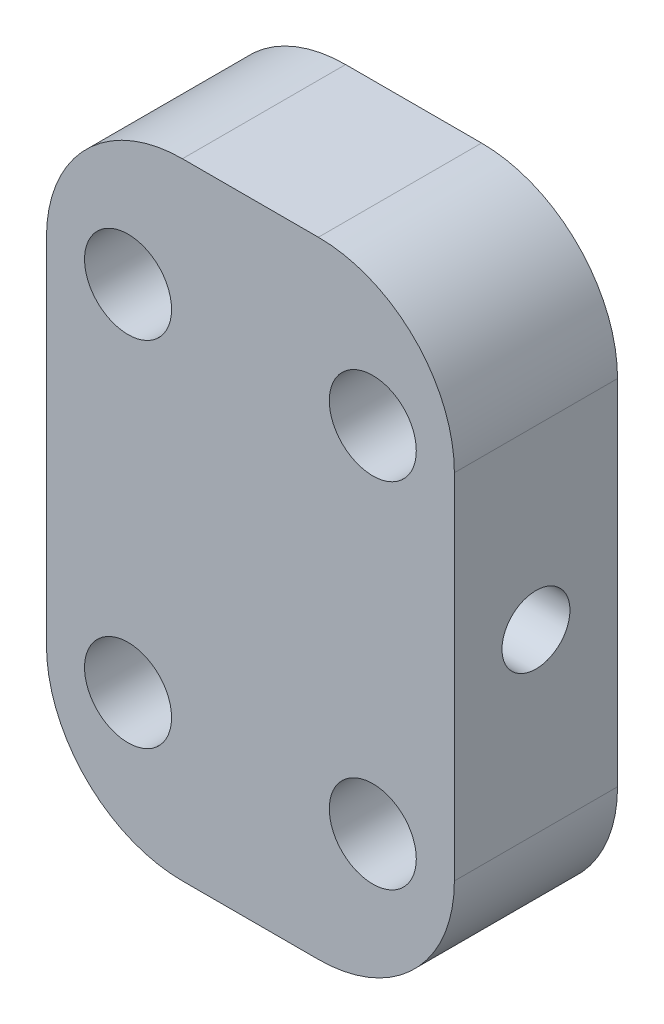
ISO-10303-21;
HEADER;
FILE_DESCRIPTION(('STEP AP214'),'2;1');
FILE_NAME('part.step','',(''),(''),'','','');
FILE_SCHEMA(('AUTOMOTIVE_DESIGN { 1 0 10303 214 1 1 1 1 }'));
ENDSEC;
DATA;
#1=APPLICATION_CONTEXT('core data for automotive mechanical design processes');
#2=APPLICATION_PROTOCOL_DEFINITION('international standard','automotive_design',2000,#1);
#3=PRODUCT_CONTEXT('',#1,'mechanical');
#4=PRODUCT('Part','Part','',(#3));
#5=PRODUCT_RELATED_PRODUCT_CATEGORY('part','',(#4));
#6=PRODUCT_DEFINITION_FORMATION('','',#4);
#7=PRODUCT_DEFINITION_CONTEXT('part definition',#1,'design');
#8=PRODUCT_DEFINITION('design','',#6,#7);
#9=PRODUCT_DEFINITION_SHAPE('','',#8);
#10=(LENGTH_UNIT() NAMED_UNIT(*) SI_UNIT(.MILLI.,.METRE.));
#11=(NAMED_UNIT(*) PLANE_ANGLE_UNIT() SI_UNIT($,.RADIAN.));
#12=(NAMED_UNIT(*) SI_UNIT($,.STERADIAN.) SOLID_ANGLE_UNIT());
#13=UNCERTAINTY_MEASURE_WITH_UNIT(LENGTH_MEASURE(1.E-05),#10,'distance_accuracy_value','');
#14=(GEOMETRIC_REPRESENTATION_CONTEXT(3) GLOBAL_UNCERTAINTY_ASSIGNED_CONTEXT((#13)) GLOBAL_UNIT_ASSIGNED_CONTEXT((#10,
#11,#12)) REPRESENTATION_CONTEXT('',''));
#15=CARTESIAN_POINT('',(0.,0.,0.));
#16=DIRECTION('',(0.,0.,1.));
#17=DIRECTION('',(1.,0.,0.));
#18=AXIS2_PLACEMENT_3D('',#15,#16,#17);
#19=CARTESIAN_POINT('',(7.5,11.5,3.));
#20=DIRECTION('',(-1.,0.,0.));
#21=DIRECTION('',(0.,-1.,0.));
#22=AXIS2_PLACEMENT_3D('',#19,#20,#21);
#23=PLANE('',#22);
#24=CARTESIAN_POINT('',(7.5,0.,0.));
#25=DIRECTION('',(1.,0.,0.));
#26=DIRECTION('',(0.,0.,-1.));
#27=AXIS2_PLACEMENT_3D('',#24,#25,#26);
#28=CIRCLE('',#27,1.25);
#29=CARTESIAN_POINT('',(7.5,0.,-1.25));
#30=VERTEX_POINT('',#29);
#31=EDGE_CURVE('E201',#30,#30,#28,.T.);
#32=ORIENTED_EDGE('',*,*,#31,.F.);
#33=EDGE_LOOP('',(#32));
#34=FACE_BOUND('',#33,.T.);
#35=DIRECTION('',(0.,1.,0.));
#36=VECTOR('',#35,1.);
#37=CARTESIAN_POINT('',(7.5,11.5,-3.));
#38=LINE('',#37,#36);
#39=CARTESIAN_POINT('',(7.5,-6.5,-3.));
#40=VERTEX_POINT('',#39);
#41=CARTESIAN_POINT('',(7.5,6.5,-3.));
#42=VERTEX_POINT('',#41);
#43=EDGE_CURVE('E125',#40,#42,#38,.T.);
#44=ORIENTED_EDGE('',*,*,#43,.T.);
#45=DIRECTION('',(0.,0.,-1.));
#46=VECTOR('',#45,1.);
#47=CARTESIAN_POINT('',(7.5,6.5,3.));
#48=LINE('',#47,#46);
#49=CARTESIAN_POINT('',(7.5,6.5,3.));
#50=VERTEX_POINT('',#49);
#51=EDGE_CURVE('E103',#42,#50,#48,.F.);
#52=ORIENTED_EDGE('',*,*,#51,.T.);
#53=DIRECTION('',(0.,1.,0.));
#54=VECTOR('',#53,1.);
#55=CARTESIAN_POINT('',(7.5,11.5,3.));
#56=LINE('',#55,#54);
#57=CARTESIAN_POINT('',(7.5,-6.5,3.));
#58=VERTEX_POINT('',#57);
#59=EDGE_CURVE('E135',#58,#50,#56,.T.);
#60=ORIENTED_EDGE('',*,*,#59,.F.);
#61=DIRECTION('',(0.,0.,-1.));
#62=VECTOR('',#61,1.);
#63=CARTESIAN_POINT('',(7.5,-6.5,3.));
#64=LINE('',#63,#62);
#65=EDGE_CURVE('E108',#58,#40,#64,.T.);
#66=ORIENTED_EDGE('',*,*,#65,.T.);
#67=EDGE_LOOP('',(#44,#52,#60,#66));
#68=FACE_BOUND('',#67,.T.);
#69=ADVANCED_FACE('F32',(#34,#68),#23,.F.);
#70=CARTESIAN_POINT('',(-7.5,11.5,3.));
#71=DIRECTION('',(0.,-1.,0.));
#72=DIRECTION('',(0.,0.,-1.));
#73=AXIS2_PLACEMENT_3D('',#70,#71,#72);
#74=PLANE('',#73);
#75=DIRECTION('',(-1.,0.,0.));
#76=VECTOR('',#75,1.);
#77=CARTESIAN_POINT('',(-7.5,11.5,3.));
#78=LINE('',#77,#76);
#79=CARTESIAN_POINT('',(2.5,11.5,3.));
#80=VERTEX_POINT('',#79);
#81=CARTESIAN_POINT('',(-2.5,11.5,3.));
#82=VERTEX_POINT('',#81);
#83=EDGE_CURVE('E118',#80,#82,#78,.T.);
#84=ORIENTED_EDGE('',*,*,#83,.F.);
#85=DIRECTION('',(0.,0.,-1.));
#86=VECTOR('',#85,1.);
#87=CARTESIAN_POINT('',(2.5,11.5,3.));
#88=LINE('',#87,#86);
#89=CARTESIAN_POINT('',(2.5,11.5,-3.));
#90=VERTEX_POINT('',#89);
#91=EDGE_CURVE('E102',#80,#90,#88,.T.);
#92=ORIENTED_EDGE('',*,*,#91,.T.);
#93=DIRECTION('',(-1.,0.,0.));
#94=VECTOR('',#93,1.);
#95=CARTESIAN_POINT('',(-7.5,11.5,-3.));
#96=LINE('',#95,#94);
#97=CARTESIAN_POINT('',(-2.5,11.5,-3.));
#98=VERTEX_POINT('',#97);
#99=EDGE_CURVE('E115',#90,#98,#96,.T.);
#100=ORIENTED_EDGE('',*,*,#99,.T.);
#101=DIRECTION('',(0.,0.,-1.));
#102=VECTOR('',#101,1.);
#103=CARTESIAN_POINT('',(-2.5,11.5,3.));
#104=LINE('',#103,#102);
#105=EDGE_CURVE('E120',#98,#82,#104,.F.);
#106=ORIENTED_EDGE('',*,*,#105,.T.);
#107=EDGE_LOOP('',(#84,#92,#100,#106));
#108=FACE_BOUND('',#107,.T.);
#109=ADVANCED_FACE('F114',(#108),#74,.F.);
#110=CARTESIAN_POINT('',(-7.5,11.5,3.));
#111=DIRECTION('',(1.,0.,0.));
#112=DIRECTION('',(0.,1.,0.));
#113=AXIS2_PLACEMENT_3D('',#110,#111,#112);
#114=PLANE('',#113);
#115=CARTESIAN_POINT('',(-7.5,0.,0.));
#116=DIRECTION('',(1.,0.,0.));
#117=DIRECTION('',(0.,0.,-1.));
#118=AXIS2_PLACEMENT_3D('',#115,#116,#117);
#119=CIRCLE('',#118,1.25);
#120=CARTESIAN_POINT('',(-7.5,0.,-1.25));
#121=VERTEX_POINT('',#120);
#122=EDGE_CURVE('E198',#121,#121,#119,.T.);
#123=ORIENTED_EDGE('',*,*,#122,.T.);
#124=EDGE_LOOP('',(#123));
#125=FACE_BOUND('',#124,.T.);
#126=DIRECTION('',(0.,-1.,0.));
#127=VECTOR('',#126,1.);
#128=CARTESIAN_POINT('',(-7.5,11.5,-3.));
#129=LINE('',#128,#127);
#130=CARTESIAN_POINT('',(-7.5,6.5,-3.));
#131=VERTEX_POINT('',#130);
#132=CARTESIAN_POINT('',(-7.5,-6.5,-3.));
#133=VERTEX_POINT('',#132);
#134=EDGE_CURVE('E124',#131,#133,#129,.T.);
#135=ORIENTED_EDGE('',*,*,#134,.T.);
#136=DIRECTION('',(0.,0.,-1.));
#137=VECTOR('',#136,1.);
#138=CARTESIAN_POINT('',(-7.5,-6.5,3.));
#139=LINE('',#138,#137);
#140=CARTESIAN_POINT('',(-7.5,-6.5,3.));
#141=VERTEX_POINT('',#140);
#142=EDGE_CURVE('E11',#133,#141,#139,.F.);
#143=ORIENTED_EDGE('',*,*,#142,.T.);
#144=DIRECTION('',(0.,-1.,0.));
#145=VECTOR('',#144,1.);
#146=CARTESIAN_POINT('',(-7.5,11.5,3.));
#147=LINE('',#146,#145);
#148=CARTESIAN_POINT('',(-7.5,6.5,3.));
#149=VERTEX_POINT('',#148);
#150=EDGE_CURVE('E161',#149,#141,#147,.T.);
#151=ORIENTED_EDGE('',*,*,#150,.F.);
#152=DIRECTION('',(0.,0.,-1.));
#153=VECTOR('',#152,1.);
#154=CARTESIAN_POINT('',(-7.5,6.5,3.));
#155=LINE('',#154,#153);
#156=EDGE_CURVE('E40',#149,#131,#155,.T.);
#157=ORIENTED_EDGE('',*,*,#156,.T.);
#158=EDGE_LOOP('',(#135,#143,#151,#157));
#159=FACE_BOUND('',#158,.T.);
#160=ADVANCED_FACE('F159',(#125,#159),#114,.F.);
#161=CARTESIAN_POINT('',(-7.5,-11.5,3.));
#162=DIRECTION('',(0.,1.,0.));
#163=DIRECTION('',(0.,0.,1.));
#164=AXIS2_PLACEMENT_3D('',#161,#162,#163);
#165=PLANE('',#164);
#166=DIRECTION('',(1.,0.,0.));
#167=VECTOR('',#166,1.);
#168=CARTESIAN_POINT('',(-7.5,-11.5,-3.));
#169=LINE('',#168,#167);
#170=CARTESIAN_POINT('',(-2.5,-11.5,-3.));
#171=VERTEX_POINT('',#170);
#172=CARTESIAN_POINT('',(2.5,-11.5,-3.));
#173=VERTEX_POINT('',#172);
#174=EDGE_CURVE('E128',#171,#173,#169,.T.);
#175=ORIENTED_EDGE('',*,*,#174,.T.);
#176=DIRECTION('',(0.,0.,-1.));
#177=VECTOR('',#176,1.);
#178=CARTESIAN_POINT('',(2.5,-11.5,3.));
#179=LINE('',#178,#177);
#180=CARTESIAN_POINT('',(2.5,-11.5,3.));
#181=VERTEX_POINT('',#180);
#182=EDGE_CURVE('E47',#173,#181,#179,.F.);
#183=ORIENTED_EDGE('',*,*,#182,.T.);
#184=DIRECTION('',(1.,0.,0.));
#185=VECTOR('',#184,1.);
#186=CARTESIAN_POINT('',(-7.5,-11.5,3.));
#187=LINE('',#186,#185);
#188=CARTESIAN_POINT('',(-2.5,-11.5,3.));
#189=VERTEX_POINT('',#188);
#190=EDGE_CURVE('E136',#189,#181,#187,.T.);
#191=ORIENTED_EDGE('',*,*,#190,.F.);
#192=DIRECTION('',(0.,0.,-1.));
#193=VECTOR('',#192,1.);
#194=CARTESIAN_POINT('',(-2.5,-11.5,3.));
#195=LINE('',#194,#193);
#196=EDGE_CURVE('E152',#189,#171,#195,.T.);
#197=ORIENTED_EDGE('',*,*,#196,.T.);
#198=EDGE_LOOP('',(#175,#183,#191,#197));
#199=FACE_BOUND('',#198,.T.);
#200=ADVANCED_FACE('F168',(#199),#165,.F.);
#201=CARTESIAN_POINT('',(0.,0.,3.));
#202=DIRECTION('',(0.,0.,1.));
#203=DIRECTION('',(1.,0.,0.));
#204=AXIS2_PLACEMENT_3D('',#201,#202,#203);
#205=PLANE('',#204);
#206=CARTESIAN_POINT('',(-4.5,6.5,3.));
#207=DIRECTION('',(0.,0.,1.));
#208=DIRECTION('',(1.,0.,0.));
#209=AXIS2_PLACEMENT_3D('',#206,#207,#208);
#210=CIRCLE('',#209,1.6);
#211=CARTESIAN_POINT('',(-2.9,6.5,3.));
#212=VERTEX_POINT('',#211);
#213=EDGE_CURVE('E195',#212,#212,#210,.T.);
#214=ORIENTED_EDGE('',*,*,#213,.F.);
#215=EDGE_LOOP('',(#214));
#216=FACE_BOUND('',#215,.T.);
#217=CARTESIAN_POINT('',(4.5,6.5,3.));
#218=DIRECTION('',(0.,0.,1.));
#219=DIRECTION('',(1.,0.,0.));
#220=AXIS2_PLACEMENT_3D('',#217,#218,#219);
#221=CIRCLE('',#220,1.6);
#222=CARTESIAN_POINT('',(6.1,6.5,3.));
#223=VERTEX_POINT('',#222);
#224=EDGE_CURVE('E189',#223,#223,#221,.T.);
#225=ORIENTED_EDGE('',*,*,#224,.F.);
#226=EDGE_LOOP('',(#225));
#227=FACE_BOUND('',#226,.T.);
#228=CARTESIAN_POINT('',(4.5,-6.5,3.));
#229=DIRECTION('',(0.,0.,1.));
#230=DIRECTION('',(1.,0.,0.));
#231=AXIS2_PLACEMENT_3D('',#228,#229,#230);
#232=CIRCLE('',#231,1.6);
#233=CARTESIAN_POINT('',(6.1,-6.5,3.));
#234=VERTEX_POINT('',#233);
#235=EDGE_CURVE('E183',#234,#234,#232,.T.);
#236=ORIENTED_EDGE('',*,*,#235,.F.);
#237=EDGE_LOOP('',(#236));
#238=FACE_BOUND('',#237,.T.);
#239=CARTESIAN_POINT('',(-4.5,-6.5,3.));
#240=DIRECTION('',(0.,0.,1.));
#241=DIRECTION('',(1.,0.,0.));
#242=AXIS2_PLACEMENT_3D('',#239,#240,#241);
#243=CIRCLE('',#242,1.6);
#244=CARTESIAN_POINT('',(-2.9,-6.5,3.));
#245=VERTEX_POINT('',#244);
#246=EDGE_CURVE('E177',#245,#245,#243,.T.);
#247=ORIENTED_EDGE('',*,*,#246,.F.);
#248=EDGE_LOOP('',(#247));
#249=FACE_BOUND('',#248,.T.);
#250=ORIENTED_EDGE('',*,*,#59,.T.);
#251=CARTESIAN_POINT('',(2.5,6.5,3.));
#252=DIRECTION('',(0.,0.,1.));
#253=DIRECTION('',(1.,0.,0.));
#254=AXIS2_PLACEMENT_3D('',#251,#252,#253);
#255=CIRCLE('',#254,5.);
#256=EDGE_CURVE('E150',#50,#80,#255,.T.);
#257=ORIENTED_EDGE('',*,*,#256,.T.);
#258=ORIENTED_EDGE('',*,*,#83,.T.);
#259=CARTESIAN_POINT('',(-2.5,6.5,3.));
#260=DIRECTION('',(0.,0.,1.));
#261=DIRECTION('',(1.,0.,0.));
#262=AXIS2_PLACEMENT_3D('',#259,#260,#261);
#263=CIRCLE('',#262,5.);
#264=EDGE_CURVE('E145',#82,#149,#263,.T.);
#265=ORIENTED_EDGE('',*,*,#264,.T.);
#266=ORIENTED_EDGE('',*,*,#150,.T.);
#267=CARTESIAN_POINT('',(-2.5,-6.5,3.));
#268=DIRECTION('',(0.,0.,1.));
#269=DIRECTION('',(1.,0.,0.));
#270=AXIS2_PLACEMENT_3D('',#267,#268,#269);
#271=CIRCLE('',#270,5.);
#272=EDGE_CURVE('E54',#141,#189,#271,.T.);
#273=ORIENTED_EDGE('',*,*,#272,.T.);
#274=ORIENTED_EDGE('',*,*,#190,.T.);
#275=CARTESIAN_POINT('',(2.5,-6.5,3.));
#276=DIRECTION('',(0.,0.,1.));
#277=DIRECTION('',(1.,0.,0.));
#278=AXIS2_PLACEMENT_3D('',#275,#276,#277);
#279=CIRCLE('',#278,5.);
#280=EDGE_CURVE('E148',#181,#58,#279,.T.);
#281=ORIENTED_EDGE('',*,*,#280,.T.);
#282=EDGE_LOOP('',(#250,#257,#258,#265,#266,#273,#274,#281));
#283=FACE_BOUND('',#282,.T.);
#284=ADVANCED_FACE('F214',(#216,#227,#238,#249,#283),#205,.T.);
#285=CARTESIAN_POINT('',(0.,0.,-3.));
#286=DIRECTION('',(0.,0.,1.));
#287=DIRECTION('',(1.,0.,0.));
#288=AXIS2_PLACEMENT_3D('',#285,#286,#287);
#289=PLANE('',#288);
#290=CARTESIAN_POINT('',(-4.5,6.5,-3.));
#291=DIRECTION('',(0.,0.,1.));
#292=DIRECTION('',(1.,0.,0.));
#293=AXIS2_PLACEMENT_3D('',#290,#291,#292);
#294=CIRCLE('',#293,1.6);
#295=CARTESIAN_POINT('',(-2.9,6.5,-3.));
#296=VERTEX_POINT('',#295);
#297=EDGE_CURVE('E192',#296,#296,#294,.T.);
#298=ORIENTED_EDGE('',*,*,#297,.T.);
#299=EDGE_LOOP('',(#298));
#300=FACE_BOUND('',#299,.T.);
#301=CARTESIAN_POINT('',(4.5,6.5,-3.));
#302=DIRECTION('',(0.,0.,1.));
#303=DIRECTION('',(1.,0.,0.));
#304=AXIS2_PLACEMENT_3D('',#301,#302,#303);
#305=CIRCLE('',#304,1.6);
#306=CARTESIAN_POINT('',(6.1,6.5,-3.));
#307=VERTEX_POINT('',#306);
#308=EDGE_CURVE('E186',#307,#307,#305,.T.);
#309=ORIENTED_EDGE('',*,*,#308,.T.);
#310=EDGE_LOOP('',(#309));
#311=FACE_BOUND('',#310,.T.);
#312=CARTESIAN_POINT('',(4.5,-6.5,-3.));
#313=DIRECTION('',(0.,0.,1.));
#314=DIRECTION('',(1.,0.,0.));
#315=AXIS2_PLACEMENT_3D('',#312,#313,#314);
#316=CIRCLE('',#315,1.6);
#317=CARTESIAN_POINT('',(6.1,-6.5,-3.));
#318=VERTEX_POINT('',#317);
#319=EDGE_CURVE('E180',#318,#318,#316,.T.);
#320=ORIENTED_EDGE('',*,*,#319,.T.);
#321=EDGE_LOOP('',(#320));
#322=FACE_BOUND('',#321,.T.);
#323=CARTESIAN_POINT('',(-4.5,-6.5,-3.));
#324=DIRECTION('',(0.,0.,1.));
#325=DIRECTION('',(1.,0.,0.));
#326=AXIS2_PLACEMENT_3D('',#323,#324,#325);
#327=CIRCLE('',#326,1.6);
#328=CARTESIAN_POINT('',(-2.9,-6.5,-3.));
#329=VERTEX_POINT('',#328);
#330=EDGE_CURVE('E130',#329,#329,#327,.T.);
#331=ORIENTED_EDGE('',*,*,#330,.T.);
#332=EDGE_LOOP('',(#331));
#333=FACE_BOUND('',#332,.T.);
#334=ORIENTED_EDGE('',*,*,#99,.F.);
#335=CARTESIAN_POINT('',(2.5,6.5,-3.));
#336=DIRECTION('',(0.,0.,1.));
#337=DIRECTION('',(1.,0.,0.));
#338=AXIS2_PLACEMENT_3D('',#335,#336,#337);
#339=CIRCLE('',#338,5.);
#340=EDGE_CURVE('E98',#90,#42,#339,.F.);
#341=ORIENTED_EDGE('',*,*,#340,.T.);
#342=ORIENTED_EDGE('',*,*,#43,.F.);
#343=CARTESIAN_POINT('',(2.5,-6.5,-3.));
#344=DIRECTION('',(0.,0.,1.));
#345=DIRECTION('',(1.,0.,0.));
#346=AXIS2_PLACEMENT_3D('',#343,#344,#345);
#347=CIRCLE('',#346,5.);
#348=EDGE_CURVE('E109',#40,#173,#347,.F.);
#349=ORIENTED_EDGE('',*,*,#348,.T.);
#350=ORIENTED_EDGE('',*,*,#174,.F.);
#351=CARTESIAN_POINT('',(-2.5,-6.5,-3.));
#352=DIRECTION('',(0.,0.,1.));
#353=DIRECTION('',(1.,0.,0.));
#354=AXIS2_PLACEMENT_3D('',#351,#352,#353);
#355=CIRCLE('',#354,5.);
#356=EDGE_CURVE('E139',#171,#133,#355,.F.);
#357=ORIENTED_EDGE('',*,*,#356,.T.);
#358=ORIENTED_EDGE('',*,*,#134,.F.);
#359=CARTESIAN_POINT('',(-2.5,6.5,-3.));
#360=DIRECTION('',(0.,0.,1.));
#361=DIRECTION('',(1.,0.,0.));
#362=AXIS2_PLACEMENT_3D('',#359,#360,#361);
#363=CIRCLE('',#362,5.);
#364=EDGE_CURVE('E119',#131,#98,#363,.F.);
#365=ORIENTED_EDGE('',*,*,#364,.T.);
#366=EDGE_LOOP('',(#334,#341,#342,#349,#350,#357,#358,#365));
#367=FACE_BOUND('',#366,.T.);
#368=ADVANCED_FACE('F122',(#300,#311,#322,#333,#367),#289,.F.);
#369=CARTESIAN_POINT('',(2.5,6.5,3.));
#370=DIRECTION('',(0.,0.,-1.));
#371=DIRECTION('',(-1.,0.,0.));
#372=AXIS2_PLACEMENT_3D('',#369,#370,#371);
#373=CYLINDRICAL_SURFACE('',#372,5.);
#374=ORIENTED_EDGE('',*,*,#256,.F.);
#375=ORIENTED_EDGE('',*,*,#51,.F.);
#376=ORIENTED_EDGE('',*,*,#340,.F.);
#377=ORIENTED_EDGE('',*,*,#91,.F.);
#378=EDGE_LOOP('',(#374,#375,#376,#377));
#379=FACE_BOUND('',#378,.T.);
#380=ADVANCED_FACE('F101',(#379),#373,.T.);
#381=CARTESIAN_POINT('',(2.5,-6.5,3.));
#382=DIRECTION('',(0.,0.,-1.));
#383=DIRECTION('',(-1.,0.,0.));
#384=AXIS2_PLACEMENT_3D('',#381,#382,#383);
#385=CYLINDRICAL_SURFACE('',#384,5.);
#386=ORIENTED_EDGE('',*,*,#280,.F.);
#387=ORIENTED_EDGE('',*,*,#182,.F.);
#388=ORIENTED_EDGE('',*,*,#348,.F.);
#389=ORIENTED_EDGE('',*,*,#65,.F.);
#390=EDGE_LOOP('',(#386,#387,#388,#389));
#391=FACE_BOUND('',#390,.T.);
#392=ADVANCED_FACE('F213',(#391),#385,.T.);
#393=CARTESIAN_POINT('',(-2.5,-6.5,3.));
#394=DIRECTION('',(0.,0.,-1.));
#395=DIRECTION('',(-1.,0.,0.));
#396=AXIS2_PLACEMENT_3D('',#393,#394,#395);
#397=CYLINDRICAL_SURFACE('',#396,5.);
#398=ORIENTED_EDGE('',*,*,#272,.F.);
#399=ORIENTED_EDGE('',*,*,#142,.F.);
#400=ORIENTED_EDGE('',*,*,#356,.F.);
#401=ORIENTED_EDGE('',*,*,#196,.F.);
#402=EDGE_LOOP('',(#398,#399,#400,#401));
#403=FACE_BOUND('',#402,.T.);
#404=ADVANCED_FACE('F167',(#403),#397,.T.);
#405=CARTESIAN_POINT('',(-2.5,6.5,3.));
#406=DIRECTION('',(0.,0.,-1.));
#407=DIRECTION('',(-1.,0.,0.));
#408=AXIS2_PLACEMENT_3D('',#405,#406,#407);
#409=CYLINDRICAL_SURFACE('',#408,5.);
#410=ORIENTED_EDGE('',*,*,#264,.F.);
#411=ORIENTED_EDGE('',*,*,#105,.F.);
#412=ORIENTED_EDGE('',*,*,#364,.F.);
#413=ORIENTED_EDGE('',*,*,#156,.F.);
#414=EDGE_LOOP('',(#410,#411,#412,#413));
#415=FACE_BOUND('',#414,.T.);
#416=ADVANCED_FACE('F34',(#415),#409,.T.);
#417=CARTESIAN_POINT('',(-4.5,-6.5,3.));
#418=DIRECTION('',(0.,0.,1.));
#419=DIRECTION('',(1.,0.,0.));
#420=AXIS2_PLACEMENT_3D('',#417,#418,#419);
#421=CYLINDRICAL_SURFACE('',#420,1.6);
#422=ORIENTED_EDGE('',*,*,#330,.F.);
#423=EDGE_LOOP('',(#422));
#424=FACE_BOUND('',#423,.T.);
#425=ORIENTED_EDGE('',*,*,#246,.T.);
#426=EDGE_LOOP('',(#425));
#427=FACE_BOUND('',#426,.T.);
#428=ADVANCED_FACE('F216',(#424,#427),#421,.F.);
#429=CARTESIAN_POINT('',(4.5,-6.5,3.));
#430=DIRECTION('',(0.,0.,1.));
#431=DIRECTION('',(1.,0.,0.));
#432=AXIS2_PLACEMENT_3D('',#429,#430,#431);
#433=CYLINDRICAL_SURFACE('',#432,1.6);
#434=ORIENTED_EDGE('',*,*,#319,.F.);
#435=EDGE_LOOP('',(#434));
#436=FACE_BOUND('',#435,.T.);
#437=ORIENTED_EDGE('',*,*,#235,.T.);
#438=EDGE_LOOP('',(#437));
#439=FACE_BOUND('',#438,.T.);
#440=ADVANCED_FACE('F221',(#436,#439),#433,.F.);
#441=CARTESIAN_POINT('',(4.5,6.5,3.));
#442=DIRECTION('',(0.,0.,1.));
#443=DIRECTION('',(1.,0.,0.));
#444=AXIS2_PLACEMENT_3D('',#441,#442,#443);
#445=CYLINDRICAL_SURFACE('',#444,1.6);
#446=ORIENTED_EDGE('',*,*,#308,.F.);
#447=EDGE_LOOP('',(#446));
#448=FACE_BOUND('',#447,.T.);
#449=ORIENTED_EDGE('',*,*,#224,.T.);
#450=EDGE_LOOP('',(#449));
#451=FACE_BOUND('',#450,.T.);
#452=ADVANCED_FACE('F246',(#448,#451),#445,.F.);
#453=CARTESIAN_POINT('',(-4.5,6.5,3.));
#454=DIRECTION('',(0.,0.,1.));
#455=DIRECTION('',(1.,0.,0.));
#456=AXIS2_PLACEMENT_3D('',#453,#454,#455);
#457=CYLINDRICAL_SURFACE('',#456,1.6);
#458=ORIENTED_EDGE('',*,*,#297,.F.);
#459=EDGE_LOOP('',(#458));
#460=FACE_BOUND('',#459,.T.);
#461=ORIENTED_EDGE('',*,*,#213,.T.);
#462=EDGE_LOOP('',(#461));
#463=FACE_BOUND('',#462,.T.);
#464=ADVANCED_FACE('F250',(#460,#463),#457,.F.);
#465=CARTESIAN_POINT('',(7.5,0.,0.));
#466=DIRECTION('',(1.,0.,0.));
#467=DIRECTION('',(0.,0.,-1.));
#468=AXIS2_PLACEMENT_3D('',#465,#466,#467);
#469=CYLINDRICAL_SURFACE('',#468,1.25);
#470=ORIENTED_EDGE('',*,*,#122,.F.);
#471=EDGE_LOOP('',(#470));
#472=FACE_BOUND('',#471,.T.);
#473=ORIENTED_EDGE('',*,*,#31,.T.);
#474=EDGE_LOOP('',(#473));
#475=FACE_BOUND('',#474,.T.);
#476=ADVANCED_FACE('F205',(#472,#475),#469,.F.);
#477=CLOSED_SHELL('',(#69,#109,#160,#200,#284,#368,#380,#392,#404,#416,#428,#440,#452,#464,#476));
#478=MANIFOLD_SOLID_BREP('B2',#477);
#479=ADVANCED_BREP_SHAPE_REPRESENTATION('',(#18,#478),#14);
#480=SHAPE_DEFINITION_REPRESENTATION(#9,#479);
ENDSEC;
END-ISO-10303-21;
